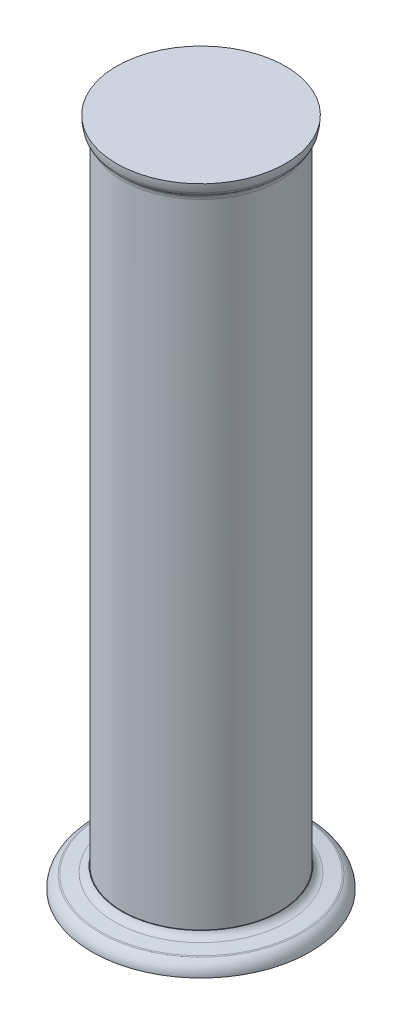
ISO-10303-21;
HEADER;
FILE_DESCRIPTION(('STEP AP214'),'2;1');
FILE_NAME('part.step','',(''),(''),'','','');
FILE_SCHEMA(('AUTOMOTIVE_DESIGN { 1 0 10303 214 1 1 1 1 }'));
ENDSEC;
DATA;
#1=APPLICATION_CONTEXT('core data for automotive mechanical design processes');
#2=APPLICATION_PROTOCOL_DEFINITION('international standard','automotive_design',2000,#1);
#3=PRODUCT_CONTEXT('',#1,'mechanical');
#4=PRODUCT('Part','Part','',(#3));
#5=PRODUCT_RELATED_PRODUCT_CATEGORY('part','',(#4));
#6=PRODUCT_DEFINITION_FORMATION('','',#4);
#7=PRODUCT_DEFINITION_CONTEXT('part definition',#1,'design');
#8=PRODUCT_DEFINITION('design','',#6,#7);
#9=PRODUCT_DEFINITION_SHAPE('','',#8);
#10=(LENGTH_UNIT() NAMED_UNIT(*) SI_UNIT(.MILLI.,.METRE.));
#11=(NAMED_UNIT(*) PLANE_ANGLE_UNIT() SI_UNIT($,.RADIAN.));
#12=(NAMED_UNIT(*) SI_UNIT($,.STERADIAN.) SOLID_ANGLE_UNIT());
#13=UNCERTAINTY_MEASURE_WITH_UNIT(LENGTH_MEASURE(1.E-05),#10,'distance_accuracy_value','');
#14=(GEOMETRIC_REPRESENTATION_CONTEXT(3) GLOBAL_UNCERTAINTY_ASSIGNED_CONTEXT((#13)) GLOBAL_UNIT_ASSIGNED_CONTEXT((#10,
#11,#12)) REPRESENTATION_CONTEXT('',''));
#15=CARTESIAN_POINT('',(0.,0.,0.));
#16=DIRECTION('',(0.,0.,1.));
#17=DIRECTION('',(1.,0.,0.));
#18=AXIS2_PLACEMENT_3D('',#15,#16,#17);
#19=CARTESIAN_POINT('',(8.82541444001208E-07,157.065468265684,-269.750000036549));
#20=DIRECTION('',(0.,-1.,0.));
#21=DIRECTION('',(0.,0.,-1.));
#22=AXIS2_PLACEMENT_3D('',#19,#20,#21);
#23=PLANE('',#22);
#24=CARTESIAN_POINT('',(8.82541441646057E-07,157.065468265684,-176.000000036549));
#25=DIRECTION('',(0.,1.,0.));
#26=DIRECTION('',(0.,0.,1.));
#27=AXIS2_PLACEMENT_3D('',#24,#25,#26);
#28=CIRCLE('',#27,93.7500000000001);
#29=CARTESIAN_POINT('',(8.82541441646057E-07,157.065468265684,-82.2500000365485));
#30=VERTEX_POINT('',#29);
#31=EDGE_CURVE('E42',#30,#30,#28,.T.);
#32=ORIENTED_EDGE('',*,*,#31,.F.);
#33=EDGE_LOOP('',(#32));
#34=FACE_BOUND('',#33,.T.);
#35=ADVANCED_FACE('F39',(#34),#23,.T.);
#36=CARTESIAN_POINT('',(8.82541441646057E-07,157.065468265684,-176.000000036549));
#37=DIRECTION('',(0.,1.,0.));
#38=DIRECTION('',(0.,0.,1.));
#39=AXIS2_PLACEMENT_3D('',#36,#37,#38);
#40=TOROIDAL_SURFACE('',#39,81.9986912105606,11.7513087894394);
#41=CARTESIAN_POINT('',(8.82541441449356E-07,167.773152113818,-176.000000036549));
#42=DIRECTION('',(0.,1.,0.));
#43=DIRECTION('',(0.,0.,1.));
#44=AXIS2_PLACEMENT_3D('',#41,#42,#43);
#45=CIRCLE('',#44,86.8400510270961);
#46=CARTESIAN_POINT('',(8.82541441449356E-07,167.773152113818,-89.1599490094524));
#47=VERTEX_POINT('',#46);
#48=EDGE_CURVE('E88',#47,#47,#45,.T.);
#49=ORIENTED_EDGE('',*,*,#48,.F.);
#50=EDGE_LOOP('',(#49));
#51=FACE_BOUND('',#50,.T.);
#52=ORIENTED_EDGE('',*,*,#31,.T.);
#53=EDGE_LOOP('',(#52));
#54=FACE_BOUND('',#53,.T.);
#55=ADVANCED_FACE('F97',(#51,#54),#40,.T.);
#56=CARTESIAN_POINT('',(8.82541441449356E-07,164.540916476581,-176.000000036549));
#57=DIRECTION('',(0.,1.,0.));
#58=DIRECTION('',(0.,0.,1.));
#59=AXIS2_PLACEMENT_3D('',#56,#57,#58);
#60=TOROIDAL_SURFACE('',#59,85.3786317366469,3.54726564513084);
#61=CARTESIAN_POINT('',(8.82541436194952E-07,168.061741341505,-176.000000036549));
#62=DIRECTION('',(0.,-1.,0.));
#63=DIRECTION('',(0.,0.,1.));
#64=AXIS2_PLACEMENT_3D('',#61,#62,#63);
#65=CIRCLE('',#64,85.8109346717026);
#66=CARTESIAN_POINT('',(8.82541429049756E-07,168.061741341505,-90.189065364846));
#67=VERTEX_POINT('',#66);
#68=EDGE_CURVE('E85',#67,#67,#65,.F.);
#69=ORIENTED_EDGE('',*,*,#68,.F.);
#70=EDGE_LOOP('',(#69));
#71=FACE_BOUND('',#70,.T.);
#72=ORIENTED_EDGE('',*,*,#48,.T.);
#73=EDGE_LOOP('',(#72));
#74=FACE_BOUND('',#73,.T.);
#75=ADVANCED_FACE('F93',(#71,#74),#60,.T.);
#76=CARTESIAN_POINT('',(8.82541442231742E-07,732.815468265684,-248.499430400423));
#77=DIRECTION('',(0.,1.,0.));
#78=DIRECTION('',(0.,0.,1.));
#79=AXIS2_PLACEMENT_3D('',#76,#77,#78);
#80=PLANE('',#79);
#81=CARTESIAN_POINT('',(8.82541440634262E-07,732.815468265684,-176.000000036549));
#82=DIRECTION('',(0.,1.,0.));
#83=DIRECTION('',(0.,0.,1.));
#84=AXIS2_PLACEMENT_3D('',#81,#82,#83);
#85=CIRCLE('',#84,72.4994303638744);
#86=CARTESIAN_POINT('',(8.82541440634262E-07,732.815468265684,-103.500569672674));
#87=VERTEX_POINT('',#86);
#88=EDGE_CURVE('E82',#87,#87,#85,.F.);
#89=ORIENTED_EDGE('',*,*,#88,.F.);
#90=EDGE_LOOP('',(#89));
#91=FACE_BOUND('',#90,.T.);
#92=ADVANCED_FACE('F96',(#91),#80,.T.);
#93=CARTESIAN_POINT('',(8.82541436194952E-07,168.061741341505,-176.000000036549));
#94=DIRECTION('',(0.,-1.,0.));
#95=DIRECTION('',(0.,0.,-1.));
#96=AXIS2_PLACEMENT_3D('',#93,#94,#95);
#97=CONICAL_SURFACE('',#96,85.8109346717029,1.4486232791553);
#98=ORIENTED_EDGE('',*,*,#68,.T.);
#99=EDGE_LOOP('',(#98));
#100=FACE_BOUND('',#99,.T.);
#101=CARTESIAN_POINT('',(8.82541431658494E-07,169.501384761751,-176.000000036549));
#102=DIRECTION('',(0.,1.,0.));
#103=DIRECTION('',(0.,0.,1.));
#104=AXIS2_PLACEMENT_3D('',#101,#102,#103);
#105=CIRCLE('',#104,74.0859799244615);
#106=CARTESIAN_POINT('',(8.82541431658494E-07,169.501384761751,-101.914020112087));
#107=VERTEX_POINT('',#106);
#108=EDGE_CURVE('E80',#107,#107,#105,.F.);
#109=ORIENTED_EDGE('',*,*,#108,.T.);
#110=EDGE_LOOP('',(#109));
#111=FACE_BOUND('',#110,.T.);
#112=ADVANCED_FACE('F113',(#100,#111),#97,.T.);
#113=CARTESIAN_POINT('',(8.82541440634262E-07,733.001717061094,-176.000000036549));
#114=DIRECTION('',(0.,1.,0.));
#115=DIRECTION('',(0.,0.,1.));
#116=AXIS2_PLACEMENT_3D('',#113,#114,#115);
#117=TOROIDAL_SURFACE('',#116,42.0530434196712,30.4469566060376);
#118=ORIENTED_EDGE('',*,*,#88,.T.);
#119=EDGE_LOOP('',(#118));
#120=FACE_BOUND('',#119,.T.);
#121=CARTESIAN_POINT('',(8.82541440575303E-07,725.403074422488,-176.000000036549));
#122=DIRECTION('',(0.,1.,0.));
#123=DIRECTION('',(0.,0.,1.));
#124=AXIS2_PLACEMENT_3D('',#121,#122,#123);
#125=CIRCLE('',#124,71.5365607915977);
#126=CARTESIAN_POINT('',(8.82541440575303E-07,725.403074422488,-104.463439244951));
#127=VERTEX_POINT('',#126);
#128=EDGE_CURVE('E59',#127,#127,#125,.F.);
#129=ORIENTED_EDGE('',*,*,#128,.F.);
#130=EDGE_LOOP('',(#129));
#131=FACE_BOUND('',#130,.T.);
#132=ADVANCED_FACE('F73',(#120,#131),#117,.T.);
#133=CARTESIAN_POINT('',(8.82541431876373E-07,176.945480899061,-176.000000036549));
#134=DIRECTION('',(0.,1.,0.));
#135=DIRECTION('',(0.,0.,1.));
#136=AXIS2_PLACEMENT_3D('',#133,#134,#135);
#137=TOROIDAL_SURFACE('',#136,75.,7.50000000000001);
#138=ORIENTED_EDGE('',*,*,#108,.F.);
#139=EDGE_LOOP('',(#138));
#140=FACE_BOUND('',#139,.T.);
#141=CARTESIAN_POINT('',(8.82541431797565E-07,174.252898495494,-176.000000036549));
#142=DIRECTION('',(0.,1.,0.));
#143=DIRECTION('',(0.,0.,1.));
#144=AXIS2_PLACEMENT_3D('',#141,#142,#143);
#145=CIRCLE('',#144,68.);
#146=CARTESIAN_POINT('',(8.82541431797565E-07,174.252898495494,-108.000000036549));
#147=VERTEX_POINT('',#146);
#148=EDGE_CURVE('E105',#147,#147,#145,.T.);
#149=ORIENTED_EDGE('',*,*,#148,.F.);
#150=EDGE_LOOP('',(#149));
#151=FACE_BOUND('',#150,.T.);
#152=ADVANCED_FACE('F67',(#140,#151),#137,.F.);
#153=CARTESIAN_POINT('',(8.82541440575303E-07,726.96288603538,-176.000000036549));
#154=DIRECTION('',(0.,1.,0.));
#155=DIRECTION('',(0.,0.,1.));
#156=AXIS2_PLACEMENT_3D('',#153,#154,#155);
#157=TOROIDAL_SURFACE('',#156,65.4843308114742,6.25000000000136);
#158=ORIENTED_EDGE('',*,*,#128,.T.);
#159=EDGE_LOOP('',(#158));
#160=FACE_BOUND('',#159,.T.);
#161=CARTESIAN_POINT('',(8.82541434612639E-07,722.591211124844,-176.000000036549));
#162=DIRECTION('',(0.,1.,0.));
#163=DIRECTION('',(-1.,0.,0.));
#164=AXIS2_PLACEMENT_3D('',#161,#162,#163);
#165=CIRCLE('',#164,69.9509803921568);
#166=CARTESIAN_POINT('',(-69.9509795096153,722.591211124844,-176.000000036549));
#167=VERTEX_POINT('',#166);
#168=EDGE_CURVE('E51',#167,#167,#165,.T.);
#169=ORIENTED_EDGE('',*,*,#168,.T.);
#170=EDGE_LOOP('',(#169));
#171=FACE_BOUND('',#170,.T.);
#172=ADVANCED_FACE('F62',(#160,#171),#157,.T.);
#173=CARTESIAN_POINT('',(8.82541441857089E-07,174.252898495494,-244.000000036549));
#174=DIRECTION('',(0.,1.,0.));
#175=DIRECTION('',(0.,0.,1.));
#176=AXIS2_PLACEMENT_3D('',#173,#174,#175);
#177=PLANE('',#176);
#178=CARTESIAN_POINT('',(8.82541436194952E-07,174.252898495494,-176.000000036549));
#179=DIRECTION('',(0.,-1.,0.));
#180=DIRECTION('',(0.,0.,-1.));
#181=AXIS2_PLACEMENT_3D('',#178,#179,#180);
#182=CIRCLE('',#181,67.5);
#183=CARTESIAN_POINT('',(8.82541436194952E-07,174.252898495494,-243.500000036549));
#184=VERTEX_POINT('',#183);
#185=EDGE_CURVE('E46',#184,#184,#182,.F.);
#186=ORIENTED_EDGE('',*,*,#185,.F.);
#187=EDGE_LOOP('',(#186));
#188=FACE_BOUND('',#187,.T.);
#189=ORIENTED_EDGE('',*,*,#148,.T.);
#190=EDGE_LOOP('',(#189));
#191=FACE_BOUND('',#190,.T.);
#192=ADVANCED_FACE('F66',(#188,#191),#177,.T.);
#193=CARTESIAN_POINT('',(8.82541432061769E-07,717.628354082855,-176.000000036549));
#194=DIRECTION('',(0.,1.,0.));
#195=DIRECTION('',(-1.,0.,0.));
#196=AXIS2_PLACEMENT_3D('',#193,#194,#195);
#197=TOROIDAL_SURFACE('',#196,73.7500000000003,6.2500000000003);
#198=CARTESIAN_POINT('',(8.82541436194952E-07,717.628354082855,-176.000000036549));
#199=DIRECTION('',(0.,-1.,0.));
#200=DIRECTION('',(0.,0.,-1.));
#201=AXIS2_PLACEMENT_3D('',#198,#199,#200);
#202=CIRCLE('',#201,67.5);
#203=CARTESIAN_POINT('',(8.82541436194952E-07,717.628354082855,-243.500000036549));
#204=VERTEX_POINT('',#203);
#205=EDGE_CURVE('E10',#204,#204,#202,.T.);
#206=ORIENTED_EDGE('',*,*,#205,.F.);
#207=EDGE_LOOP('',(#206));
#208=FACE_BOUND('',#207,.T.);
#209=ORIENTED_EDGE('',*,*,#168,.F.);
#210=EDGE_LOOP('',(#209));
#211=FACE_BOUND('',#210,.T.);
#212=ADVANCED_FACE('F120',(#208,#211),#197,.F.);
#213=CARTESIAN_POINT('',(8.82541436194952E-07,157.065468265684,-176.000000036549));
#214=DIRECTION('',(0.,-1.,0.));
#215=DIRECTION('',(0.,0.,-1.));
#216=AXIS2_PLACEMENT_3D('',#213,#214,#215);
#217=CYLINDRICAL_SURFACE('',#216,67.5);
#218=ORIENTED_EDGE('',*,*,#185,.T.);
#219=EDGE_LOOP('',(#218));
#220=FACE_BOUND('',#219,.T.);
#221=ORIENTED_EDGE('',*,*,#205,.T.);
#222=EDGE_LOOP('',(#221));
#223=FACE_BOUND('',#222,.T.);
#224=ADVANCED_FACE('F118',(#220,#223),#217,.T.);
#225=CLOSED_SHELL('',(#35,#55,#75,#92,#112,#132,#152,#172,#192,#212,#224));
#226=MANIFOLD_SOLID_BREP('B2',#225);
#227=ADVANCED_BREP_SHAPE_REPRESENTATION('',(#18,#226),#14);
#228=SHAPE_DEFINITION_REPRESENTATION(#9,#227);
ENDSEC;
END-ISO-10303-21;
